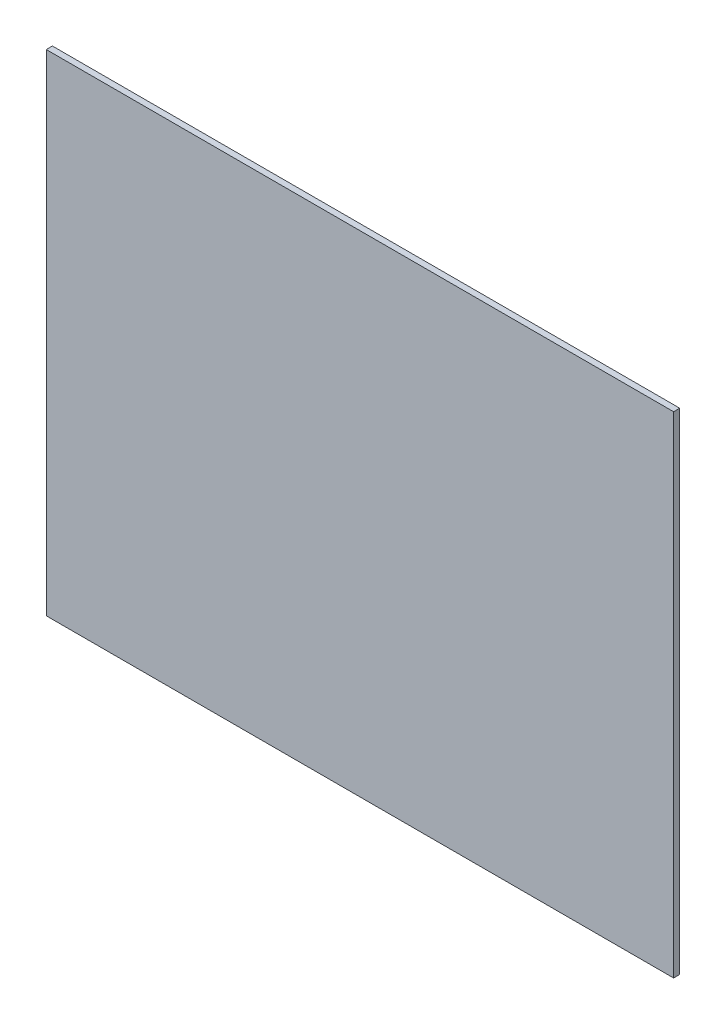
ISO-10303-21;
HEADER;
FILE_DESCRIPTION(('STEP AP214'),'2;1');
FILE_NAME('part.step','',(''),(''),'','','');
FILE_SCHEMA(('AUTOMOTIVE_DESIGN { 1 0 10303 214 1 1 1 1 }'));
ENDSEC;
DATA;
#1=APPLICATION_CONTEXT('core data for automotive mechanical design processes');
#2=APPLICATION_PROTOCOL_DEFINITION('international standard','automotive_design',2000,#1);
#3=PRODUCT_CONTEXT('',#1,'mechanical');
#4=PRODUCT('Part','Part','',(#3));
#5=PRODUCT_RELATED_PRODUCT_CATEGORY('part','',(#4));
#6=PRODUCT_DEFINITION_FORMATION('','',#4);
#7=PRODUCT_DEFINITION_CONTEXT('part definition',#1,'design');
#8=PRODUCT_DEFINITION('design','',#6,#7);
#9=PRODUCT_DEFINITION_SHAPE('','',#8);
#10=(LENGTH_UNIT() NAMED_UNIT(*) SI_UNIT(.MILLI.,.METRE.));
#11=(NAMED_UNIT(*) PLANE_ANGLE_UNIT() SI_UNIT($,.RADIAN.));
#12=(NAMED_UNIT(*) SI_UNIT($,.STERADIAN.) SOLID_ANGLE_UNIT());
#13=UNCERTAINTY_MEASURE_WITH_UNIT(LENGTH_MEASURE(1.E-05),#10,'distance_accuracy_value','');
#14=(GEOMETRIC_REPRESENTATION_CONTEXT(3) GLOBAL_UNCERTAINTY_ASSIGNED_CONTEXT((#13)) GLOBAL_UNIT_ASSIGNED_CONTEXT((#10,
#11,#12)) REPRESENTATION_CONTEXT('',''));
#15=CARTESIAN_POINT('',(0.,0.,0.));
#16=DIRECTION('',(0.,0.,1.));
#17=DIRECTION('',(1.,0.,0.));
#18=AXIS2_PLACEMENT_3D('',#15,#16,#17);
#19=CARTESIAN_POINT('',(0.,0.,0.));
#20=DIRECTION('',(0.,0.,-1.));
#21=DIRECTION('',(-1.,0.,0.));
#22=AXIS2_PLACEMENT_3D('',#19,#20,#21);
#23=PLANE('',#22);
#24=DIRECTION('',(-1.,0.,0.));
#25=VECTOR('',#24,1.);
#26=CARTESIAN_POINT('',(327.,-240.,0.));
#27=LINE('',#26,#25);
#28=CARTESIAN_POINT('',(327.,-240.,0.));
#29=VERTEX_POINT('',#28);
#30=CARTESIAN_POINT('',(-287.,-240.,0.));
#31=VERTEX_POINT('',#30);
#32=EDGE_CURVE('E98',#29,#31,#27,.T.);
#33=ORIENTED_EDGE('',*,*,#32,.T.);
#34=DIRECTION('',(0.,1.,0.));
#35=VECTOR('',#34,1.);
#36=CARTESIAN_POINT('',(-287.,-240.,0.));
#37=LINE('',#36,#35);
#38=CARTESIAN_POINT('',(-287.,240.,0.));
#39=VERTEX_POINT('',#38);
#40=EDGE_CURVE('E108',#31,#39,#37,.T.);
#41=ORIENTED_EDGE('',*,*,#40,.T.);
#42=DIRECTION('',(1.,0.,0.));
#43=VECTOR('',#42,1.);
#44=CARTESIAN_POINT('',(327.,240.,0.));
#45=LINE('',#44,#43);
#46=CARTESIAN_POINT('',(327.,240.,0.));
#47=VERTEX_POINT('',#46);
#48=EDGE_CURVE('E106',#39,#47,#45,.T.);
#49=ORIENTED_EDGE('',*,*,#48,.T.);
#50=DIRECTION('',(0.,-1.,0.));
#51=VECTOR('',#50,1.);
#52=CARTESIAN_POINT('',(327.,-240.,0.));
#53=LINE('',#52,#51);
#54=EDGE_CURVE('E70',#47,#29,#53,.T.);
#55=ORIENTED_EDGE('',*,*,#54,.T.);
#56=EDGE_LOOP('',(#33,#41,#49,#55));
#57=FACE_BOUND('',#56,.T.);
#58=ADVANCED_FACE('F49',(#57),#23,.T.);
#59=CARTESIAN_POINT('',(-287.,-240.,10.));
#60=DIRECTION('',(-1.,0.,0.));
#61=DIRECTION('',(0.,0.,1.));
#62=AXIS2_PLACEMENT_3D('',#59,#60,#61);
#63=PLANE('',#62);
#64=DIRECTION('',(0.,1.,0.));
#65=VECTOR('',#64,1.);
#66=CARTESIAN_POINT('',(-287.,0.,6.));
#67=LINE('',#66,#65);
#68=CARTESIAN_POINT('',(-287.,-240.,6.));
#69=VERTEX_POINT('',#68);
#70=CARTESIAN_POINT('',(-287.,240.,6.));
#71=VERTEX_POINT('',#70);
#72=EDGE_CURVE('E11',#69,#71,#67,.T.);
#73=ORIENTED_EDGE('',*,*,#72,.T.);
#74=DIRECTION('',(0.,0.,-1.));
#75=VECTOR('',#74,1.);
#76=CARTESIAN_POINT('',(-287.,240.,10.));
#77=LINE('',#76,#75);
#78=EDGE_CURVE('E63',#71,#39,#77,.T.);
#79=ORIENTED_EDGE('',*,*,#78,.T.);
#80=ORIENTED_EDGE('',*,*,#40,.F.);
#81=DIRECTION('',(0.,0.,-1.));
#82=VECTOR('',#81,1.);
#83=CARTESIAN_POINT('',(-287.,-240.,10.));
#84=LINE('',#83,#82);
#85=EDGE_CURVE('E94',#69,#31,#84,.T.);
#86=ORIENTED_EDGE('',*,*,#85,.F.);
#87=EDGE_LOOP('',(#73,#79,#80,#86));
#88=FACE_BOUND('',#87,.T.);
#89=ADVANCED_FACE('F120',(#88),#63,.T.);
#90=CARTESIAN_POINT('',(327.,-240.,10.));
#91=DIRECTION('',(0.,-1.,0.));
#92=DIRECTION('',(0.,0.,-1.));
#93=AXIS2_PLACEMENT_3D('',#90,#91,#92);
#94=PLANE('',#93);
#95=DIRECTION('',(-1.,0.,0.));
#96=VECTOR('',#95,1.);
#97=CARTESIAN_POINT('',(0.,-240.,6.));
#98=LINE('',#97,#96);
#99=CARTESIAN_POINT('',(327.,-240.,6.));
#100=VERTEX_POINT('',#99);
#101=EDGE_CURVE('E56',#100,#69,#98,.T.);
#102=ORIENTED_EDGE('',*,*,#101,.T.);
#103=ORIENTED_EDGE('',*,*,#85,.T.);
#104=ORIENTED_EDGE('',*,*,#32,.F.);
#105=DIRECTION('',(0.,0.,-1.));
#106=VECTOR('',#105,1.);
#107=CARTESIAN_POINT('',(327.,-240.,10.));
#108=LINE('',#107,#106);
#109=EDGE_CURVE('E87',#100,#29,#108,.T.);
#110=ORIENTED_EDGE('',*,*,#109,.F.);
#111=EDGE_LOOP('',(#102,#103,#104,#110));
#112=FACE_BOUND('',#111,.T.);
#113=ADVANCED_FACE('F99',(#112),#94,.T.);
#114=CARTESIAN_POINT('',(327.,-240.,10.));
#115=DIRECTION('',(1.,0.,0.));
#116=DIRECTION('',(0.,0.,-1.));
#117=AXIS2_PLACEMENT_3D('',#114,#115,#116);
#118=PLANE('',#117);
#119=DIRECTION('',(0.,-1.,0.));
#120=VECTOR('',#119,1.);
#121=CARTESIAN_POINT('',(327.,0.,6.));
#122=LINE('',#121,#120);
#123=CARTESIAN_POINT('',(327.,240.,6.));
#124=VERTEX_POINT('',#123);
#125=EDGE_CURVE('E91',#124,#100,#122,.T.);
#126=ORIENTED_EDGE('',*,*,#125,.T.);
#127=ORIENTED_EDGE('',*,*,#109,.T.);
#128=ORIENTED_EDGE('',*,*,#54,.F.);
#129=DIRECTION('',(0.,0.,-1.));
#130=VECTOR('',#129,1.);
#131=CARTESIAN_POINT('',(327.,240.,10.));
#132=LINE('',#131,#130);
#133=EDGE_CURVE('E95',#124,#47,#132,.T.);
#134=ORIENTED_EDGE('',*,*,#133,.F.);
#135=EDGE_LOOP('',(#126,#127,#128,#134));
#136=FACE_BOUND('',#135,.T.);
#137=ADVANCED_FACE('F89',(#136),#118,.T.);
#138=CARTESIAN_POINT('',(327.,240.,10.));
#139=DIRECTION('',(0.,1.,0.));
#140=DIRECTION('',(0.,0.,1.));
#141=AXIS2_PLACEMENT_3D('',#138,#139,#140);
#142=PLANE('',#141);
#143=DIRECTION('',(1.,0.,0.));
#144=VECTOR('',#143,1.);
#145=CARTESIAN_POINT('',(0.,240.,6.));
#146=LINE('',#145,#144);
#147=EDGE_CURVE('E112',#71,#124,#146,.T.);
#148=ORIENTED_EDGE('',*,*,#147,.T.);
#149=ORIENTED_EDGE('',*,*,#133,.T.);
#150=ORIENTED_EDGE('',*,*,#48,.F.);
#151=ORIENTED_EDGE('',*,*,#78,.F.);
#152=EDGE_LOOP('',(#148,#149,#150,#151));
#153=FACE_BOUND('',#152,.T.);
#154=ADVANCED_FACE('F123',(#153),#142,.T.);
#155=CARTESIAN_POINT('',(0.,0.,6.));
#156=DIRECTION('',(0.,0.,-1.));
#157=DIRECTION('',(-1.,0.,0.));
#158=AXIS2_PLACEMENT_3D('',#155,#156,#157);
#159=PLANE('',#158);
#160=ORIENTED_EDGE('',*,*,#72,.F.);
#161=ORIENTED_EDGE('',*,*,#101,.F.);
#162=ORIENTED_EDGE('',*,*,#125,.F.);
#163=ORIENTED_EDGE('',*,*,#147,.F.);
#164=EDGE_LOOP('',(#160,#161,#162,#163));
#165=FACE_BOUND('',#164,.T.);
#166=ADVANCED_FACE('F122',(#165),#159,.F.);
#167=CLOSED_SHELL('',(#58,#89,#113,#137,#154,#166));
#168=MANIFOLD_SOLID_BREP('B2',#167);
#169=ADVANCED_BREP_SHAPE_REPRESENTATION('',(#18,#168),#14);
#170=SHAPE_DEFINITION_REPRESENTATION(#9,#169);
ENDSEC;
END-ISO-10303-21;
